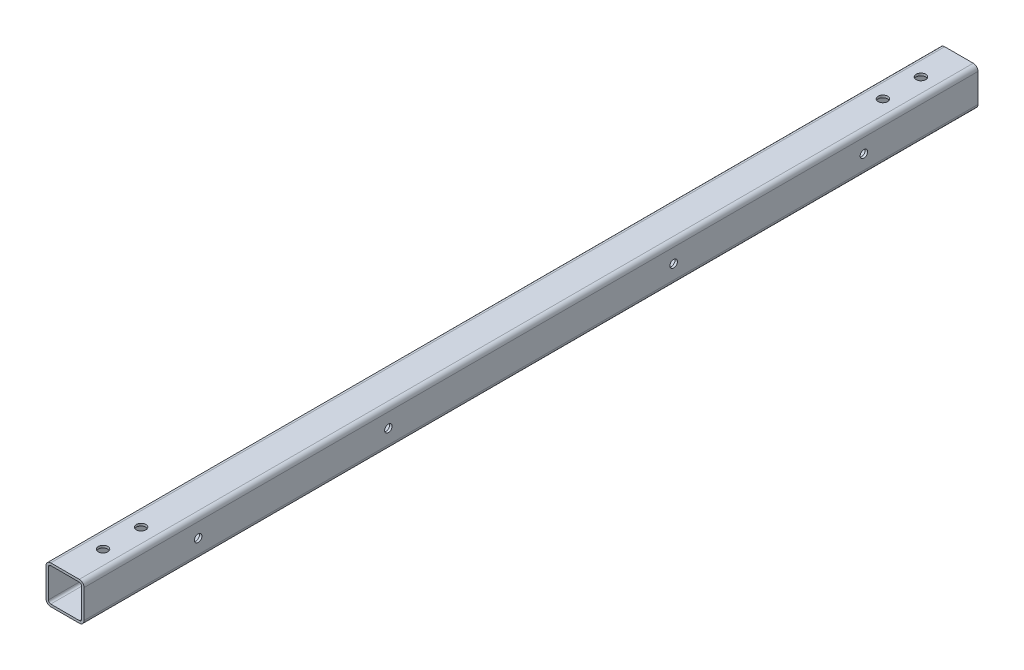
ISO-10303-21;
HEADER;
FILE_DESCRIPTION(('STEP AP214'),'2;1');
FILE_NAME('part.step','',(''),(''),'','','');
FILE_SCHEMA(('AUTOMOTIVE_DESIGN { 1 0 10303 214 1 1 1 1 }'));
ENDSEC;
DATA;
#1=APPLICATION_CONTEXT('core data for automotive mechanical design processes');
#2=APPLICATION_PROTOCOL_DEFINITION('international standard','automotive_design',2000,#1);
#3=PRODUCT_CONTEXT('',#1,'mechanical');
#4=PRODUCT('Part','Part','',(#3));
#5=PRODUCT_RELATED_PRODUCT_CATEGORY('part','',(#4));
#6=PRODUCT_DEFINITION_FORMATION('','',#4);
#7=PRODUCT_DEFINITION_CONTEXT('part definition',#1,'design');
#8=PRODUCT_DEFINITION('design','',#6,#7);
#9=PRODUCT_DEFINITION_SHAPE('','',#8);
#10=(LENGTH_UNIT() NAMED_UNIT(*) SI_UNIT(.MILLI.,.METRE.));
#11=(NAMED_UNIT(*) PLANE_ANGLE_UNIT() SI_UNIT($,.RADIAN.));
#12=(NAMED_UNIT(*) SI_UNIT($,.STERADIAN.) SOLID_ANGLE_UNIT());
#13=UNCERTAINTY_MEASURE_WITH_UNIT(LENGTH_MEASURE(1.E-05),#10,'distance_accuracy_value','');
#14=(GEOMETRIC_REPRESENTATION_CONTEXT(3) GLOBAL_UNCERTAINTY_ASSIGNED_CONTEXT((#13)) GLOBAL_UNIT_ASSIGNED_CONTEXT((#10,
#11,#12)) REPRESENTATION_CONTEXT('',''));
#15=CARTESIAN_POINT('',(0.,0.,0.));
#16=DIRECTION('',(0.,0.,1.));
#17=DIRECTION('',(1.,0.,0.));
#18=AXIS2_PLACEMENT_3D('',#15,#16,#17);
#19=CARTESIAN_POINT('',(-12.7,-12.7,-298.45));
#20=DIRECTION('',(0.,0.,-1.));
#21=DIRECTION('',(-1.,0.,0.));
#22=AXIS2_PLACEMENT_3D('',#19,#20,#21);
#23=PLANE('',#22);
#24=DIRECTION('',(0.,-1.,0.));
#25=VECTOR('',#24,1.);
#26=CARTESIAN_POINT('',(-12.7,12.7,-298.45));
#27=LINE('',#26,#25);
#28=CARTESIAN_POINT('',(-12.7,9.525,-298.45));
#29=VERTEX_POINT('',#28);
#30=CARTESIAN_POINT('',(-12.7,-9.525,-298.45));
#31=VERTEX_POINT('',#30);
#32=EDGE_CURVE('E234',#29,#31,#27,.T.);
#33=ORIENTED_EDGE('',*,*,#32,.F.);
#34=CARTESIAN_POINT('',(-9.525,9.525,-298.45));
#35=DIRECTION('',(0.,0.,-1.));
#36=DIRECTION('',(-1.,0.,0.));
#37=AXIS2_PLACEMENT_3D('',#34,#35,#36);
#38=CIRCLE('',#37,3.175);
#39=CARTESIAN_POINT('',(-9.525,12.7,-298.45));
#40=VERTEX_POINT('',#39);
#41=EDGE_CURVE('E260',#29,#40,#38,.T.);
#42=ORIENTED_EDGE('',*,*,#41,.T.);
#43=DIRECTION('',(1.,0.,0.));
#44=VECTOR('',#43,1.);
#45=CARTESIAN_POINT('',(-12.7,12.7,-298.45));
#46=LINE('',#45,#44);
#47=CARTESIAN_POINT('',(9.525,12.7,-298.45));
#48=VERTEX_POINT('',#47);
#49=EDGE_CURVE('E221',#40,#48,#46,.T.);
#50=ORIENTED_EDGE('',*,*,#49,.T.);
#51=CARTESIAN_POINT('',(9.525,9.525,-298.45));
#52=DIRECTION('',(0.,0.,-1.));
#53=DIRECTION('',(-1.,0.,0.));
#54=AXIS2_PLACEMENT_3D('',#51,#52,#53);
#55=CIRCLE('',#54,3.175);
#56=CARTESIAN_POINT('',(12.7,9.525,-298.45));
#57=VERTEX_POINT('',#56);
#58=EDGE_CURVE('E256',#48,#57,#55,.T.);
#59=ORIENTED_EDGE('',*,*,#58,.T.);
#60=DIRECTION('',(0.,1.,0.));
#61=VECTOR('',#60,1.);
#62=CARTESIAN_POINT('',(12.7,-12.7,-298.45));
#63=LINE('',#62,#61);
#64=CARTESIAN_POINT('',(12.7,-9.525,-298.45));
#65=VERTEX_POINT('',#64);
#66=EDGE_CURVE('E242',#65,#57,#63,.T.);
#67=ORIENTED_EDGE('',*,*,#66,.F.);
#68=CARTESIAN_POINT('',(9.525,-9.525,-298.45));
#69=DIRECTION('',(0.,0.,-1.));
#70=DIRECTION('',(-1.,0.,0.));
#71=AXIS2_PLACEMENT_3D('',#68,#69,#70);
#72=CIRCLE('',#71,3.175);
#73=CARTESIAN_POINT('',(9.525,-12.7,-298.45));
#74=VERTEX_POINT('',#73);
#75=EDGE_CURVE('E254',#65,#74,#72,.T.);
#76=ORIENTED_EDGE('',*,*,#75,.T.);
#77=DIRECTION('',(-1.,0.,0.));
#78=VECTOR('',#77,1.);
#79=CARTESIAN_POINT('',(12.7,-12.7,-298.45));
#80=LINE('',#79,#78);
#81=CARTESIAN_POINT('',(-9.52499999999999,-12.7,-298.45));
#82=VERTEX_POINT('',#81);
#83=EDGE_CURVE('E238',#74,#82,#80,.T.);
#84=ORIENTED_EDGE('',*,*,#83,.T.);
#85=CARTESIAN_POINT('',(-9.52499999999999,-9.525,-298.45));
#86=DIRECTION('',(0.,0.,-1.));
#87=DIRECTION('',(-1.,0.,0.));
#88=AXIS2_PLACEMENT_3D('',#85,#86,#87);
#89=CIRCLE('',#88,3.175);
#90=EDGE_CURVE('E258',#82,#31,#89,.T.);
#91=ORIENTED_EDGE('',*,*,#90,.T.);
#92=EDGE_LOOP('',(#33,#42,#50,#59,#67,#76,#84,#91));
#93=FACE_BOUND('',#92,.T.);
#94=CARTESIAN_POINT('',(-9.525,9.525,-298.45));
#95=DIRECTION('',(0.,0.,-1.));
#96=DIRECTION('',(-1.,0.,0.));
#97=AXIS2_PLACEMENT_3D('',#94,#95,#96);
#98=CIRCLE('',#97,1.5875);
#99=CARTESIAN_POINT('',(-11.1125,9.525,-298.45));
#100=VERTEX_POINT('',#99);
#101=CARTESIAN_POINT('',(-9.525,11.1125,-298.45));
#102=VERTEX_POINT('',#101);
#103=EDGE_CURVE('E202',#100,#102,#98,.T.);
#104=ORIENTED_EDGE('',*,*,#103,.F.);
#105=DIRECTION('',(0.,-1.,0.));
#106=VECTOR('',#105,1.);
#107=CARTESIAN_POINT('',(-11.1125,-12.7,-298.45));
#108=LINE('',#107,#106);
#109=CARTESIAN_POINT('',(-11.1125,-9.525,-298.45));
#110=VERTEX_POINT('',#109);
#111=EDGE_CURVE('E199',#100,#110,#108,.T.);
#112=ORIENTED_EDGE('',*,*,#111,.T.);
#113=CARTESIAN_POINT('',(-9.52499999999999,-9.525,-298.45));
#114=DIRECTION('',(0.,0.,-1.));
#115=DIRECTION('',(-1.,0.,0.));
#116=AXIS2_PLACEMENT_3D('',#113,#114,#115);
#117=CIRCLE('',#116,1.5875);
#118=CARTESIAN_POINT('',(-9.52499999999999,-11.1125,-298.45));
#119=VERTEX_POINT('',#118);
#120=EDGE_CURVE('E160',#119,#110,#117,.T.);
#121=ORIENTED_EDGE('',*,*,#120,.F.);
#122=DIRECTION('',(-1.,0.,0.));
#123=VECTOR('',#122,1.);
#124=CARTESIAN_POINT('',(-12.7,-11.1125,-298.45));
#125=LINE('',#124,#123);
#126=CARTESIAN_POINT('',(9.525,-11.1125,-298.45));
#127=VERTEX_POINT('',#126);
#128=EDGE_CURVE('E62',#127,#119,#125,.T.);
#129=ORIENTED_EDGE('',*,*,#128,.F.);
#130=CARTESIAN_POINT('',(9.525,-9.525,-298.45));
#131=DIRECTION('',(0.,0.,-1.));
#132=DIRECTION('',(-1.,0.,0.));
#133=AXIS2_PLACEMENT_3D('',#130,#131,#132);
#134=CIRCLE('',#133,1.5875);
#135=CARTESIAN_POINT('',(11.1125,-9.525,-298.45));
#136=VERTEX_POINT('',#135);
#137=EDGE_CURVE('E210',#136,#127,#134,.T.);
#138=ORIENTED_EDGE('',*,*,#137,.F.);
#139=DIRECTION('',(0.,1.,0.));
#140=VECTOR('',#139,1.);
#141=CARTESIAN_POINT('',(11.1125,-12.7,-298.45));
#142=LINE('',#141,#140);
#143=CARTESIAN_POINT('',(11.1125,9.525,-298.45));
#144=VERTEX_POINT('',#143);
#145=EDGE_CURVE('E207',#136,#144,#142,.T.);
#146=ORIENTED_EDGE('',*,*,#145,.T.);
#147=CARTESIAN_POINT('',(9.525,9.525,-298.45));
#148=DIRECTION('',(0.,0.,-1.));
#149=DIRECTION('',(-1.,0.,0.));
#150=AXIS2_PLACEMENT_3D('',#147,#148,#149);
#151=CIRCLE('',#150,1.5875);
#152=CARTESIAN_POINT('',(9.525,11.1125,-298.45));
#153=VERTEX_POINT('',#152);
#154=EDGE_CURVE('E208',#153,#144,#151,.T.);
#155=ORIENTED_EDGE('',*,*,#154,.F.);
#156=DIRECTION('',(1.,0.,0.));
#157=VECTOR('',#156,1.);
#158=CARTESIAN_POINT('',(-12.7,11.1125,-298.45));
#159=LINE('',#158,#157);
#160=EDGE_CURVE('E175',#102,#153,#159,.T.);
#161=ORIENTED_EDGE('',*,*,#160,.F.);
#162=EDGE_LOOP('',(#104,#112,#121,#129,#138,#146,#155,#161));
#163=FACE_BOUND('',#162,.T.);
#164=ADVANCED_FACE('F36',(#93,#163),#23,.T.);
#165=CARTESIAN_POINT('',(-12.7,12.7,298.45));
#166=DIRECTION('',(1.,0.,0.));
#167=DIRECTION('',(0.,1.,0.));
#168=AXIS2_PLACEMENT_3D('',#165,#166,#167);
#169=PLANE('',#168);
#170=DIRECTION('',(0.,-1.,0.));
#171=VECTOR('',#170,1.);
#172=CARTESIAN_POINT('',(-12.7,12.7,298.45));
#173=LINE('',#172,#171);
#174=CARTESIAN_POINT('',(-12.7,9.525,298.45));
#175=VERTEX_POINT('',#174);
#176=CARTESIAN_POINT('',(-12.7,-9.525,298.45));
#177=VERTEX_POINT('',#176);
#178=EDGE_CURVE('E217',#175,#177,#173,.T.);
#179=ORIENTED_EDGE('',*,*,#178,.F.);
#180=DIRECTION('',(0.,0.,-1.));
#181=VECTOR('',#180,1.);
#182=CARTESIAN_POINT('',(-12.7,9.525,-298.45));
#183=LINE('',#182,#181);
#184=EDGE_CURVE('E250',#175,#29,#183,.T.);
#185=ORIENTED_EDGE('',*,*,#184,.T.);
#186=ORIENTED_EDGE('',*,*,#32,.T.);
#187=DIRECTION('',(0.,0.,-1.));
#188=VECTOR('',#187,1.);
#189=CARTESIAN_POINT('',(-12.7,-9.525,298.45));
#190=LINE('',#189,#188);
#191=EDGE_CURVE('E233',#31,#177,#190,.F.);
#192=ORIENTED_EDGE('',*,*,#191,.T.);
#193=EDGE_LOOP('',(#179,#185,#186,#192));
#194=FACE_BOUND('',#193,.T.);
#195=ADVANCED_FACE('F378',(#194),#169,.F.);
#196=CARTESIAN_POINT('',(12.7,-12.7,298.45));
#197=DIRECTION('',(0.,-1.,0.));
#198=DIRECTION('',(1.,0.,0.));
#199=AXIS2_PLACEMENT_3D('',#196,#197,#198);
#200=PLANE('',#199);
#201=CARTESIAN_POINT('',(0.,-12.7,-273.05));
#202=DIRECTION('',(0.,-1.,0.));
#203=DIRECTION('',(1.,0.,0.));
#204=AXIS2_PLACEMENT_3D('',#201,#202,#203);
#205=CIRCLE('',#204,3.175);
#206=CARTESIAN_POINT('',(3.17500000000005,-12.7,-273.05));
#207=VERTEX_POINT('',#206);
#208=EDGE_CURVE('E698',#207,#207,#205,.T.);
#209=ORIENTED_EDGE('',*,*,#208,.F.);
#210=EDGE_LOOP('',(#209));
#211=FACE_BOUND('',#210,.T.);
#212=CARTESIAN_POINT('',(0.,-12.7,-247.65));
#213=DIRECTION('',(0.,-1.,0.));
#214=DIRECTION('',(1.,0.,0.));
#215=AXIS2_PLACEMENT_3D('',#212,#213,#214);
#216=CIRCLE('',#215,3.175);
#217=CARTESIAN_POINT('',(3.17500000000004,-12.7,-247.65));
#218=VERTEX_POINT('',#217);
#219=EDGE_CURVE('E305',#218,#218,#216,.T.);
#220=ORIENTED_EDGE('',*,*,#219,.F.);
#221=EDGE_LOOP('',(#220));
#222=FACE_BOUND('',#221,.T.);
#223=CARTESIAN_POINT('',(0.,-12.7,247.65));
#224=DIRECTION('',(0.,-1.,0.));
#225=DIRECTION('',(1.,0.,0.));
#226=AXIS2_PLACEMENT_3D('',#223,#224,#225);
#227=CIRCLE('',#226,3.175);
#228=CARTESIAN_POINT('',(3.17499999999998,-12.7,247.65));
#229=VERTEX_POINT('',#228);
#230=EDGE_CURVE('E302',#229,#229,#227,.T.);
#231=ORIENTED_EDGE('',*,*,#230,.F.);
#232=EDGE_LOOP('',(#231));
#233=FACE_BOUND('',#232,.T.);
#234=CARTESIAN_POINT('',(0.,-12.7,273.05));
#235=DIRECTION('',(0.,-1.,0.));
#236=DIRECTION('',(1.,0.,0.));
#237=AXIS2_PLACEMENT_3D('',#234,#235,#236);
#238=CIRCLE('',#237,3.17499999999999);
#239=CARTESIAN_POINT('',(3.17499999999997,-12.7,273.05));
#240=VERTEX_POINT('',#239);
#241=EDGE_CURVE('E321',#240,#240,#238,.T.);
#242=ORIENTED_EDGE('',*,*,#241,.F.);
#243=EDGE_LOOP('',(#242));
#244=FACE_BOUND('',#243,.T.);
#245=DIRECTION('',(-1.,0.,0.));
#246=VECTOR('',#245,1.);
#247=CARTESIAN_POINT('',(12.7,-12.7,298.45));
#248=LINE('',#247,#246);
#249=CARTESIAN_POINT('',(9.525,-12.7,298.45));
#250=VERTEX_POINT('',#249);
#251=CARTESIAN_POINT('',(-9.52499999999999,-12.7,298.45));
#252=VERTEX_POINT('',#251);
#253=EDGE_CURVE('E220',#250,#252,#248,.T.);
#254=ORIENTED_EDGE('',*,*,#253,.T.);
#255=DIRECTION('',(0.,0.,-1.));
#256=VECTOR('',#255,1.);
#257=CARTESIAN_POINT('',(-9.52499999999999,-12.7,-298.45));
#258=LINE('',#257,#256);
#259=EDGE_CURVE('E280',#252,#82,#258,.T.);
#260=ORIENTED_EDGE('',*,*,#259,.T.);
#261=ORIENTED_EDGE('',*,*,#83,.F.);
#262=DIRECTION('',(0.,0.,-1.));
#263=VECTOR('',#262,1.);
#264=CARTESIAN_POINT('',(9.525,-12.7,298.45));
#265=LINE('',#264,#263);
#266=EDGE_CURVE('E277',#74,#250,#265,.F.);
#267=ORIENTED_EDGE('',*,*,#266,.T.);
#268=EDGE_LOOP('',(#254,#260,#261,#267));
#269=FACE_BOUND('',#268,.T.);
#270=ADVANCED_FACE('F383',(#211,#222,#233,#244,#269),#200,.T.);
#271=CARTESIAN_POINT('',(12.7,-12.7,298.45));
#272=DIRECTION('',(-1.,0.,0.));
#273=DIRECTION('',(0.,0.,1.));
#274=AXIS2_PLACEMENT_3D('',#271,#272,#273);
#275=PLANE('',#274);
#276=CARTESIAN_POINT('',(12.7,0.,95.2500000000002));
#277=DIRECTION('',(-1.,0.,0.));
#278=DIRECTION('',(0.,0.,1.));
#279=AXIS2_PLACEMENT_3D('',#276,#277,#278);
#280=CIRCLE('',#279,2.49999999999999);
#281=CARTESIAN_POINT('',(12.7,0.,97.7500000000002));
#282=VERTEX_POINT('',#281);
#283=EDGE_CURVE('E676',#282,#282,#280,.F.);
#284=ORIENTED_EDGE('',*,*,#283,.F.);
#285=EDGE_LOOP('',(#284));
#286=FACE_BOUND('',#285,.T.);
#287=CARTESIAN_POINT('',(12.7,0.,222.25));
#288=DIRECTION('',(-1.,0.,0.));
#289=DIRECTION('',(0.,0.,1.));
#290=AXIS2_PLACEMENT_3D('',#287,#288,#289);
#291=CIRCLE('',#290,2.49999999999999);
#292=CARTESIAN_POINT('',(12.7,0.,224.75));
#293=VERTEX_POINT('',#292);
#294=EDGE_CURVE('E680',#293,#293,#291,.F.);
#295=ORIENTED_EDGE('',*,*,#294,.F.);
#296=EDGE_LOOP('',(#295));
#297=FACE_BOUND('',#296,.T.);
#298=CARTESIAN_POINT('',(12.7,0.,-222.25));
#299=DIRECTION('',(-1.,0.,0.));
#300=DIRECTION('',(0.,0.,1.));
#301=AXIS2_PLACEMENT_3D('',#298,#299,#300);
#302=CIRCLE('',#301,2.49999999999999);
#303=CARTESIAN_POINT('',(12.7,0.,-219.75));
#304=VERTEX_POINT('',#303);
#305=EDGE_CURVE('E689',#304,#304,#302,.F.);
#306=ORIENTED_EDGE('',*,*,#305,.F.);
#307=EDGE_LOOP('',(#306));
#308=FACE_BOUND('',#307,.T.);
#309=CARTESIAN_POINT('',(12.7,0.,-95.2499999999998));
#310=DIRECTION('',(-1.,0.,0.));
#311=DIRECTION('',(0.,0.,1.));
#312=AXIS2_PLACEMENT_3D('',#309,#310,#311);
#313=CIRCLE('',#312,2.49999999999999);
#314=CARTESIAN_POINT('',(12.7,0.,-92.7499999999998));
#315=VERTEX_POINT('',#314);
#316=EDGE_CURVE('E695',#315,#315,#313,.F.);
#317=ORIENTED_EDGE('',*,*,#316,.F.);
#318=EDGE_LOOP('',(#317));
#319=FACE_BOUND('',#318,.T.);
#320=ORIENTED_EDGE('',*,*,#66,.T.);
#321=DIRECTION('',(0.,0.,-1.));
#322=VECTOR('',#321,1.);
#323=CARTESIAN_POINT('',(12.7,9.525,298.45));
#324=LINE('',#323,#322);
#325=CARTESIAN_POINT('',(12.7,9.525,298.45));
#326=VERTEX_POINT('',#325);
#327=EDGE_CURVE('E11',#57,#326,#324,.F.);
#328=ORIENTED_EDGE('',*,*,#327,.T.);
#329=DIRECTION('',(0.,1.,0.));
#330=VECTOR('',#329,1.);
#331=CARTESIAN_POINT('',(12.7,-12.7,298.45));
#332=LINE('',#331,#330);
#333=CARTESIAN_POINT('',(12.7,-9.525,298.45));
#334=VERTEX_POINT('',#333);
#335=EDGE_CURVE('E225',#334,#326,#332,.T.);
#336=ORIENTED_EDGE('',*,*,#335,.F.);
#337=DIRECTION('',(0.,0.,-1.));
#338=VECTOR('',#337,1.);
#339=CARTESIAN_POINT('',(12.7,-9.525,-298.45));
#340=LINE('',#339,#338);
#341=EDGE_CURVE('E46',#334,#65,#340,.T.);
#342=ORIENTED_EDGE('',*,*,#341,.T.);
#343=EDGE_LOOP('',(#320,#328,#336,#342));
#344=FACE_BOUND('',#343,.T.);
#345=ADVANCED_FACE('F393',(#286,#297,#308,#319,#344),#275,.F.);
#346=CARTESIAN_POINT('',(-12.7,12.7,298.45));
#347=DIRECTION('',(0.,1.,0.));
#348=DIRECTION('',(-1.,0.,0.));
#349=AXIS2_PLACEMENT_3D('',#346,#347,#348);
#350=PLANE('',#349);
#351=CARTESIAN_POINT('',(0.,12.7,-273.05));
#352=DIRECTION('',(0.,-1.,0.));
#353=DIRECTION('',(1.,0.,0.));
#354=AXIS2_PLACEMENT_3D('',#351,#352,#353);
#355=CIRCLE('',#354,3.175);
#356=CARTESIAN_POINT('',(3.17500000000005,12.7,-273.05));
#357=VERTEX_POINT('',#356);
#358=EDGE_CURVE('E699',#357,#357,#355,.T.);
#359=ORIENTED_EDGE('',*,*,#358,.T.);
#360=EDGE_LOOP('',(#359));
#361=FACE_BOUND('',#360,.T.);
#362=CARTESIAN_POINT('',(0.,12.7,-247.65));
#363=DIRECTION('',(0.,-1.,0.));
#364=DIRECTION('',(1.,0.,0.));
#365=AXIS2_PLACEMENT_3D('',#362,#363,#364);
#366=CIRCLE('',#365,3.175);
#367=CARTESIAN_POINT('',(3.17500000000005,12.7,-247.65));
#368=VERTEX_POINT('',#367);
#369=EDGE_CURVE('E298',#368,#368,#366,.T.);
#370=ORIENTED_EDGE('',*,*,#369,.T.);
#371=EDGE_LOOP('',(#370));
#372=FACE_BOUND('',#371,.T.);
#373=CARTESIAN_POINT('',(0.,12.7,247.65));
#374=DIRECTION('',(0.,-1.,0.));
#375=DIRECTION('',(1.,0.,0.));
#376=AXIS2_PLACEMENT_3D('',#373,#374,#375);
#377=CIRCLE('',#376,3.175);
#378=CARTESIAN_POINT('',(3.17499999999999,12.7,247.65));
#379=VERTEX_POINT('',#378);
#380=EDGE_CURVE('E294',#379,#379,#377,.T.);
#381=ORIENTED_EDGE('',*,*,#380,.T.);
#382=EDGE_LOOP('',(#381));
#383=FACE_BOUND('',#382,.T.);
#384=CARTESIAN_POINT('',(0.,12.7,273.05));
#385=DIRECTION('',(0.,-1.,0.));
#386=DIRECTION('',(1.,0.,0.));
#387=AXIS2_PLACEMENT_3D('',#384,#385,#386);
#388=CIRCLE('',#387,3.17499999999999);
#389=CARTESIAN_POINT('',(3.17499999999997,12.7,273.05));
#390=VERTEX_POINT('',#389);
#391=EDGE_CURVE('E290',#390,#390,#388,.T.);
#392=ORIENTED_EDGE('',*,*,#391,.T.);
#393=EDGE_LOOP('',(#392));
#394=FACE_BOUND('',#393,.T.);
#395=ORIENTED_EDGE('',*,*,#49,.F.);
#396=DIRECTION('',(0.,0.,-1.));
#397=VECTOR('',#396,1.);
#398=CARTESIAN_POINT('',(-9.525,12.7,298.45));
#399=LINE('',#398,#397);
#400=CARTESIAN_POINT('',(-9.525,12.7,298.45));
#401=VERTEX_POINT('',#400);
#402=EDGE_CURVE('E266',#40,#401,#399,.F.);
#403=ORIENTED_EDGE('',*,*,#402,.T.);
#404=DIRECTION('',(1.,0.,0.));
#405=VECTOR('',#404,1.);
#406=CARTESIAN_POINT('',(-12.7,12.7,298.45));
#407=LINE('',#406,#405);
#408=CARTESIAN_POINT('',(9.525,12.7,298.45));
#409=VERTEX_POINT('',#408);
#410=EDGE_CURVE('E229',#401,#409,#407,.T.);
#411=ORIENTED_EDGE('',*,*,#410,.T.);
#412=DIRECTION('',(0.,0.,-1.));
#413=VECTOR('',#412,1.);
#414=CARTESIAN_POINT('',(9.525,12.7,-298.45));
#415=LINE('',#414,#413);
#416=EDGE_CURVE('E262',#409,#48,#415,.T.);
#417=ORIENTED_EDGE('',*,*,#416,.T.);
#418=EDGE_LOOP('',(#395,#403,#411,#417));
#419=FACE_BOUND('',#418,.T.);
#420=ADVANCED_FACE('F390',(#361,#372,#383,#394,#419),#350,.T.);
#421=CARTESIAN_POINT('',(-12.7,-12.7,298.45));
#422=DIRECTION('',(0.,0.,-1.));
#423=DIRECTION('',(-1.,0.,0.));
#424=AXIS2_PLACEMENT_3D('',#421,#422,#423);
#425=PLANE('',#424);
#426=CARTESIAN_POINT('',(-9.525,9.525,298.45));
#427=DIRECTION('',(0.,0.,-1.));
#428=DIRECTION('',(-1.,0.,0.));
#429=AXIS2_PLACEMENT_3D('',#426,#427,#428);
#430=CIRCLE('',#429,1.5875);
#431=CARTESIAN_POINT('',(-9.525,11.1125,298.45));
#432=VERTEX_POINT('',#431);
#433=CARTESIAN_POINT('',(-11.1125,9.525,298.45));
#434=VERTEX_POINT('',#433);
#435=EDGE_CURVE('E182',#432,#434,#430,.F.);
#436=ORIENTED_EDGE('',*,*,#435,.F.);
#437=DIRECTION('',(1.,0.,0.));
#438=VECTOR('',#437,1.);
#439=CARTESIAN_POINT('',(-12.7,11.1125,298.45));
#440=LINE('',#439,#438);
#441=CARTESIAN_POINT('',(9.525,11.1125,298.45));
#442=VERTEX_POINT('',#441);
#443=EDGE_CURVE('E166',#432,#442,#440,.T.);
#444=ORIENTED_EDGE('',*,*,#443,.T.);
#445=CARTESIAN_POINT('',(9.525,9.525,298.45));
#446=DIRECTION('',(0.,0.,-1.));
#447=DIRECTION('',(-1.,0.,0.));
#448=AXIS2_PLACEMENT_3D('',#445,#446,#447);
#449=CIRCLE('',#448,1.5875);
#450=CARTESIAN_POINT('',(11.1125,9.525,298.45));
#451=VERTEX_POINT('',#450);
#452=EDGE_CURVE('E183',#451,#442,#449,.F.);
#453=ORIENTED_EDGE('',*,*,#452,.F.);
#454=DIRECTION('',(0.,1.,0.));
#455=VECTOR('',#454,1.);
#456=CARTESIAN_POINT('',(11.1125,-12.7,298.45));
#457=LINE('',#456,#455);
#458=CARTESIAN_POINT('',(11.1125,-9.525,298.45));
#459=VERTEX_POINT('',#458);
#460=EDGE_CURVE('E54',#459,#451,#457,.T.);
#461=ORIENTED_EDGE('',*,*,#460,.F.);
#462=CARTESIAN_POINT('',(9.525,-9.525,298.45));
#463=DIRECTION('',(0.,0.,-1.));
#464=DIRECTION('',(-1.,0.,0.));
#465=AXIS2_PLACEMENT_3D('',#462,#463,#464);
#466=CIRCLE('',#465,1.5875);
#467=CARTESIAN_POINT('',(9.525,-11.1125,298.45));
#468=VERTEX_POINT('',#467);
#469=EDGE_CURVE('E187',#468,#459,#466,.F.);
#470=ORIENTED_EDGE('',*,*,#469,.F.);
#471=DIRECTION('',(-1.,0.,0.));
#472=VECTOR('',#471,1.);
#473=CARTESIAN_POINT('',(-12.7,-11.1125,298.45));
#474=LINE('',#473,#472);
#475=CARTESIAN_POINT('',(-9.52499999999999,-11.1125,298.45));
#476=VERTEX_POINT('',#475);
#477=EDGE_CURVE('E174',#468,#476,#474,.T.);
#478=ORIENTED_EDGE('',*,*,#477,.T.);
#479=CARTESIAN_POINT('',(-9.52499999999999,-9.525,298.45));
#480=DIRECTION('',(0.,0.,-1.));
#481=DIRECTION('',(-1.,0.,0.));
#482=AXIS2_PLACEMENT_3D('',#479,#480,#481);
#483=CIRCLE('',#482,1.5875);
#484=CARTESIAN_POINT('',(-11.1125,-9.525,298.45));
#485=VERTEX_POINT('',#484);
#486=EDGE_CURVE('E158',#485,#476,#483,.F.);
#487=ORIENTED_EDGE('',*,*,#486,.F.);
#488=DIRECTION('',(0.,-1.,0.));
#489=VECTOR('',#488,1.);
#490=CARTESIAN_POINT('',(-11.1125,-12.7,298.45));
#491=LINE('',#490,#489);
#492=EDGE_CURVE('E170',#434,#485,#491,.T.);
#493=ORIENTED_EDGE('',*,*,#492,.F.);
#494=EDGE_LOOP('',(#436,#444,#453,#461,#470,#478,#487,#493));
#495=FACE_BOUND('',#494,.T.);
#496=ORIENTED_EDGE('',*,*,#410,.F.);
#497=CARTESIAN_POINT('',(-9.525,9.525,298.45));
#498=DIRECTION('',(0.,0.,-1.));
#499=DIRECTION('',(-1.,0.,0.));
#500=AXIS2_PLACEMENT_3D('',#497,#498,#499);
#501=CIRCLE('',#500,3.175);
#502=EDGE_CURVE('E275',#401,#175,#501,.F.);
#503=ORIENTED_EDGE('',*,*,#502,.T.);
#504=ORIENTED_EDGE('',*,*,#178,.T.);
#505=CARTESIAN_POINT('',(-9.52499999999999,-9.525,298.45));
#506=DIRECTION('',(0.,0.,-1.));
#507=DIRECTION('',(-1.,0.,0.));
#508=AXIS2_PLACEMENT_3D('',#505,#506,#507);
#509=CIRCLE('',#508,3.175);
#510=EDGE_CURVE('E273',#177,#252,#509,.F.);
#511=ORIENTED_EDGE('',*,*,#510,.T.);
#512=ORIENTED_EDGE('',*,*,#253,.F.);
#513=CARTESIAN_POINT('',(9.525,-9.525,298.45));
#514=DIRECTION('',(0.,0.,-1.));
#515=DIRECTION('',(-1.,0.,0.));
#516=AXIS2_PLACEMENT_3D('',#513,#514,#515);
#517=CIRCLE('',#516,3.175);
#518=EDGE_CURVE('E269',#250,#334,#517,.F.);
#519=ORIENTED_EDGE('',*,*,#518,.T.);
#520=ORIENTED_EDGE('',*,*,#335,.T.);
#521=CARTESIAN_POINT('',(9.525,9.525,298.45));
#522=DIRECTION('',(0.,0.,-1.));
#523=DIRECTION('',(-1.,0.,0.));
#524=AXIS2_PLACEMENT_3D('',#521,#522,#523);
#525=CIRCLE('',#524,3.175);
#526=EDGE_CURVE('E271',#326,#409,#525,.F.);
#527=ORIENTED_EDGE('',*,*,#526,.T.);
#528=EDGE_LOOP('',(#496,#503,#504,#511,#512,#519,#520,#527));
#529=FACE_BOUND('',#528,.T.);
#530=ADVANCED_FACE('F178',(#495,#529),#425,.F.);
#531=CARTESIAN_POINT('',(-9.525,9.525,298.45));
#532=DIRECTION('',(0.,0.,1.));
#533=DIRECTION('',(1.,0.,0.));
#534=AXIS2_PLACEMENT_3D('',#531,#532,#533);
#535=CYLINDRICAL_SURFACE('',#534,3.175);
#536=ORIENTED_EDGE('',*,*,#502,.F.);
#537=ORIENTED_EDGE('',*,*,#402,.F.);
#538=ORIENTED_EDGE('',*,*,#41,.F.);
#539=ORIENTED_EDGE('',*,*,#184,.F.);
#540=EDGE_LOOP('',(#536,#537,#538,#539));
#541=FACE_BOUND('',#540,.T.);
#542=ADVANCED_FACE('F401',(#541),#535,.T.);
#543=CARTESIAN_POINT('',(-9.52499999999999,-9.525,298.45));
#544=DIRECTION('',(0.,0.,1.));
#545=DIRECTION('',(1.,0.,0.));
#546=AXIS2_PLACEMENT_3D('',#543,#544,#545);
#547=CYLINDRICAL_SURFACE('',#546,3.175);
#548=ORIENTED_EDGE('',*,*,#510,.F.);
#549=ORIENTED_EDGE('',*,*,#191,.F.);
#550=ORIENTED_EDGE('',*,*,#90,.F.);
#551=ORIENTED_EDGE('',*,*,#259,.F.);
#552=EDGE_LOOP('',(#548,#549,#550,#551));
#553=FACE_BOUND('',#552,.T.);
#554=ADVANCED_FACE('F404',(#553),#547,.T.);
#555=CARTESIAN_POINT('',(9.525,9.525,298.45));
#556=DIRECTION('',(0.,0.,1.));
#557=DIRECTION('',(1.,0.,0.));
#558=AXIS2_PLACEMENT_3D('',#555,#556,#557);
#559=CYLINDRICAL_SURFACE('',#558,3.175);
#560=ORIENTED_EDGE('',*,*,#526,.F.);
#561=ORIENTED_EDGE('',*,*,#327,.F.);
#562=ORIENTED_EDGE('',*,*,#58,.F.);
#563=ORIENTED_EDGE('',*,*,#416,.F.);
#564=EDGE_LOOP('',(#560,#561,#562,#563));
#565=FACE_BOUND('',#564,.T.);
#566=ADVANCED_FACE('F407',(#565),#559,.T.);
#567=CARTESIAN_POINT('',(9.525,-9.525,298.45));
#568=DIRECTION('',(0.,0.,1.));
#569=DIRECTION('',(1.,0.,0.));
#570=AXIS2_PLACEMENT_3D('',#567,#568,#569);
#571=CYLINDRICAL_SURFACE('',#570,3.175);
#572=ORIENTED_EDGE('',*,*,#518,.F.);
#573=ORIENTED_EDGE('',*,*,#266,.F.);
#574=ORIENTED_EDGE('',*,*,#75,.F.);
#575=ORIENTED_EDGE('',*,*,#341,.F.);
#576=EDGE_LOOP('',(#572,#573,#574,#575));
#577=FACE_BOUND('',#576,.T.);
#578=ADVANCED_FACE('F38',(#577),#571,.T.);
#579=CARTESIAN_POINT('',(-11.1125,12.7,298.45));
#580=DIRECTION('',(1.,0.,0.));
#581=DIRECTION('',(0.,1.,0.));
#582=AXIS2_PLACEMENT_3D('',#579,#580,#581);
#583=PLANE('',#582);
#584=ORIENTED_EDGE('',*,*,#492,.T.);
#585=DIRECTION('',(0.,0.,1.));
#586=VECTOR('',#585,1.);
#587=CARTESIAN_POINT('',(-11.1125,-9.525,298.45));
#588=LINE('',#587,#586);
#589=EDGE_CURVE('E154',#110,#485,#588,.T.);
#590=ORIENTED_EDGE('',*,*,#589,.F.);
#591=ORIENTED_EDGE('',*,*,#111,.F.);
#592=DIRECTION('',(0.,0.,1.));
#593=VECTOR('',#592,1.);
#594=CARTESIAN_POINT('',(-11.1125,9.525,298.45));
#595=LINE('',#594,#593);
#596=EDGE_CURVE('E165',#434,#100,#595,.F.);
#597=ORIENTED_EDGE('',*,*,#596,.F.);
#598=EDGE_LOOP('',(#584,#590,#591,#597));
#599=FACE_BOUND('',#598,.T.);
#600=ADVANCED_FACE('F171',(#599),#583,.T.);
#601=CARTESIAN_POINT('',(12.7,-11.1125,298.45));
#602=DIRECTION('',(0.,-1.,0.));
#603=DIRECTION('',(1.,0.,0.));
#604=AXIS2_PLACEMENT_3D('',#601,#602,#603);
#605=PLANE('',#604);
#606=CARTESIAN_POINT('',(0.,-11.1125,-273.05));
#607=DIRECTION('',(0.,-1.,0.));
#608=DIRECTION('',(1.,0.,0.));
#609=AXIS2_PLACEMENT_3D('',#606,#607,#608);
#610=CIRCLE('',#609,3.175);
#611=CARTESIAN_POINT('',(3.17500000000005,-11.1125,-273.05));
#612=VERTEX_POINT('',#611);
#613=EDGE_CURVE('E310',#612,#612,#610,.T.);
#614=ORIENTED_EDGE('',*,*,#613,.T.);
#615=EDGE_LOOP('',(#614));
#616=FACE_BOUND('',#615,.T.);
#617=CARTESIAN_POINT('',(0.,-11.1125,-247.65));
#618=DIRECTION('',(0.,-1.,0.));
#619=DIRECTION('',(1.,0.,0.));
#620=AXIS2_PLACEMENT_3D('',#617,#618,#619);
#621=CIRCLE('',#620,3.175);
#622=CARTESIAN_POINT('',(3.17500000000005,-11.1125,-247.65));
#623=VERTEX_POINT('',#622);
#624=EDGE_CURVE('E297',#623,#623,#621,.T.);
#625=ORIENTED_EDGE('',*,*,#624,.T.);
#626=EDGE_LOOP('',(#625));
#627=FACE_BOUND('',#626,.T.);
#628=CARTESIAN_POINT('',(0.,-11.1125,247.65));
#629=DIRECTION('',(0.,-1.,0.));
#630=DIRECTION('',(1.,0.,0.));
#631=AXIS2_PLACEMENT_3D('',#628,#629,#630);
#632=CIRCLE('',#631,3.175);
#633=CARTESIAN_POINT('',(3.17499999999998,-11.1125,247.65));
#634=VERTEX_POINT('',#633);
#635=EDGE_CURVE('E293',#634,#634,#632,.T.);
#636=ORIENTED_EDGE('',*,*,#635,.T.);
#637=EDGE_LOOP('',(#636));
#638=FACE_BOUND('',#637,.T.);
#639=CARTESIAN_POINT('',(0.,-11.1125,273.05));
#640=DIRECTION('',(0.,-1.,0.));
#641=DIRECTION('',(1.,0.,0.));
#642=AXIS2_PLACEMENT_3D('',#639,#640,#641);
#643=CIRCLE('',#642,3.17499999999999);
#644=CARTESIAN_POINT('',(3.17499999999997,-11.1125,273.05));
#645=VERTEX_POINT('',#644);
#646=EDGE_CURVE('E201',#645,#645,#643,.T.);
#647=ORIENTED_EDGE('',*,*,#646,.T.);
#648=EDGE_LOOP('',(#647));
#649=FACE_BOUND('',#648,.T.);
#650=ORIENTED_EDGE('',*,*,#477,.F.);
#651=DIRECTION('',(0.,0.,1.));
#652=VECTOR('',#651,1.);
#653=CARTESIAN_POINT('',(9.525,-11.1125,298.45));
#654=LINE('',#653,#652);
#655=EDGE_CURVE('E185',#127,#468,#654,.T.);
#656=ORIENTED_EDGE('',*,*,#655,.F.);
#657=ORIENTED_EDGE('',*,*,#128,.T.);
#658=DIRECTION('',(0.,0.,1.));
#659=VECTOR('',#658,1.);
#660=CARTESIAN_POINT('',(-9.52499999999999,-11.1125,298.45));
#661=LINE('',#660,#659);
#662=EDGE_CURVE('E339',#476,#119,#661,.F.);
#663=ORIENTED_EDGE('',*,*,#662,.F.);
#664=EDGE_LOOP('',(#650,#656,#657,#663));
#665=FACE_BOUND('',#664,.T.);
#666=ADVANCED_FACE('F364',(#616,#627,#638,#649,#665),#605,.F.);
#667=CARTESIAN_POINT('',(11.1125,-12.7,298.45));
#668=DIRECTION('',(-1.,0.,0.));
#669=DIRECTION('',(0.,0.,1.));
#670=AXIS2_PLACEMENT_3D('',#667,#668,#669);
#671=PLANE('',#670);
#672=CARTESIAN_POINT('',(11.1125,0.,95.2500000000002));
#673=DIRECTION('',(-1.,0.,0.));
#674=DIRECTION('',(0.,0.,1.));
#675=AXIS2_PLACEMENT_3D('',#672,#673,#674);
#676=CIRCLE('',#675,2.49999999999999);
#677=CARTESIAN_POINT('',(11.1125,0.,97.7500000000002));
#678=VERTEX_POINT('',#677);
#679=EDGE_CURVE('E673',#678,#678,#676,.T.);
#680=ORIENTED_EDGE('',*,*,#679,.F.);
#681=EDGE_LOOP('',(#680));
#682=FACE_BOUND('',#681,.T.);
#683=CARTESIAN_POINT('',(11.1125,0.,222.25));
#684=DIRECTION('',(-1.,0.,0.));
#685=DIRECTION('',(0.,0.,1.));
#686=AXIS2_PLACEMENT_3D('',#683,#684,#685);
#687=CIRCLE('',#686,2.49999999999999);
#688=CARTESIAN_POINT('',(11.1125,0.,224.75));
#689=VERTEX_POINT('',#688);
#690=EDGE_CURVE('E677',#689,#689,#687,.T.);
#691=ORIENTED_EDGE('',*,*,#690,.F.);
#692=EDGE_LOOP('',(#691));
#693=FACE_BOUND('',#692,.T.);
#694=CARTESIAN_POINT('',(11.1125,0.,-222.25));
#695=DIRECTION('',(-1.,0.,0.));
#696=DIRECTION('',(0.,0.,1.));
#697=AXIS2_PLACEMENT_3D('',#694,#695,#696);
#698=CIRCLE('',#697,2.49999999999999);
#699=CARTESIAN_POINT('',(11.1125,0.,-219.75));
#700=VERTEX_POINT('',#699);
#701=EDGE_CURVE('E686',#700,#700,#698,.T.);
#702=ORIENTED_EDGE('',*,*,#701,.F.);
#703=EDGE_LOOP('',(#702));
#704=FACE_BOUND('',#703,.T.);
#705=CARTESIAN_POINT('',(11.1125,0.,-95.2499999999998));
#706=DIRECTION('',(-1.,0.,0.));
#707=DIRECTION('',(0.,0.,1.));
#708=AXIS2_PLACEMENT_3D('',#705,#706,#707);
#709=CIRCLE('',#708,2.49999999999999);
#710=CARTESIAN_POINT('',(11.1125,0.,-92.7499999999998));
#711=VERTEX_POINT('',#710);
#712=EDGE_CURVE('E692',#711,#711,#709,.T.);
#713=ORIENTED_EDGE('',*,*,#712,.F.);
#714=EDGE_LOOP('',(#713));
#715=FACE_BOUND('',#714,.T.);
#716=ORIENTED_EDGE('',*,*,#145,.F.);
#717=DIRECTION('',(0.,0.,1.));
#718=VECTOR('',#717,1.);
#719=CARTESIAN_POINT('',(11.1125,-9.525,298.45));
#720=LINE('',#719,#718);
#721=EDGE_CURVE('E336',#459,#136,#720,.F.);
#722=ORIENTED_EDGE('',*,*,#721,.F.);
#723=ORIENTED_EDGE('',*,*,#460,.T.);
#724=DIRECTION('',(0.,0.,1.));
#725=VECTOR('',#724,1.);
#726=CARTESIAN_POINT('',(11.1125,9.525,298.45));
#727=LINE('',#726,#725);
#728=EDGE_CURVE('E239',#144,#451,#727,.T.);
#729=ORIENTED_EDGE('',*,*,#728,.F.);
#730=EDGE_LOOP('',(#716,#722,#723,#729));
#731=FACE_BOUND('',#730,.T.);
#732=ADVANCED_FACE('F361',(#682,#693,#704,#715,#731),#671,.T.);
#733=CARTESIAN_POINT('',(-12.7,11.1125,298.45));
#734=DIRECTION('',(0.,1.,0.));
#735=DIRECTION('',(-1.,0.,0.));
#736=AXIS2_PLACEMENT_3D('',#733,#734,#735);
#737=PLANE('',#736);
#738=CARTESIAN_POINT('',(0.,11.1125,-273.05));
#739=DIRECTION('',(0.,1.,0.));
#740=DIRECTION('',(-1.,0.,0.));
#741=AXIS2_PLACEMENT_3D('',#738,#739,#740);
#742=CIRCLE('',#741,3.175);
#743=CARTESIAN_POINT('',(-3.17499999999994,11.1125,-273.05));
#744=VERTEX_POINT('',#743);
#745=EDGE_CURVE('E40',#744,#744,#742,.T.);
#746=ORIENTED_EDGE('',*,*,#745,.T.);
#747=EDGE_LOOP('',(#746));
#748=FACE_BOUND('',#747,.T.);
#749=CARTESIAN_POINT('',(0.,11.1125,-247.65));
#750=DIRECTION('',(0.,1.,0.));
#751=DIRECTION('',(-1.,0.,0.));
#752=AXIS2_PLACEMENT_3D('',#749,#750,#751);
#753=CIRCLE('',#752,3.175);
#754=CARTESIAN_POINT('',(-3.17499999999995,11.1125,-247.65));
#755=VERTEX_POINT('',#754);
#756=EDGE_CURVE('E295',#755,#755,#753,.T.);
#757=ORIENTED_EDGE('',*,*,#756,.T.);
#758=EDGE_LOOP('',(#757));
#759=FACE_BOUND('',#758,.T.);
#760=CARTESIAN_POINT('',(0.,11.1125,247.65));
#761=DIRECTION('',(0.,1.,0.));
#762=DIRECTION('',(-1.,0.,0.));
#763=AXIS2_PLACEMENT_3D('',#760,#761,#762);
#764=CIRCLE('',#763,3.175);
#765=CARTESIAN_POINT('',(-3.17500000000001,11.1125,247.65));
#766=VERTEX_POINT('',#765);
#767=EDGE_CURVE('E291',#766,#766,#764,.T.);
#768=ORIENTED_EDGE('',*,*,#767,.T.);
#769=EDGE_LOOP('',(#768));
#770=FACE_BOUND('',#769,.T.);
#771=CARTESIAN_POINT('',(0.,11.1125,273.05));
#772=DIRECTION('',(0.,1.,0.));
#773=DIRECTION('',(-1.,0.,0.));
#774=AXIS2_PLACEMENT_3D('',#771,#772,#773);
#775=CIRCLE('',#774,3.17499999999999);
#776=CARTESIAN_POINT('',(-3.175,11.1125,273.05));
#777=VERTEX_POINT('',#776);
#778=EDGE_CURVE('E287',#777,#777,#775,.T.);
#779=ORIENTED_EDGE('',*,*,#778,.T.);
#780=EDGE_LOOP('',(#779));
#781=FACE_BOUND('',#780,.T.);
#782=ORIENTED_EDGE('',*,*,#160,.T.);
#783=DIRECTION('',(0.,0.,1.));
#784=VECTOR('',#783,1.);
#785=CARTESIAN_POINT('',(9.525,11.1125,298.45));
#786=LINE('',#785,#784);
#787=EDGE_CURVE('E204',#442,#153,#786,.F.);
#788=ORIENTED_EDGE('',*,*,#787,.F.);
#789=ORIENTED_EDGE('',*,*,#443,.F.);
#790=DIRECTION('',(0.,0.,1.));
#791=VECTOR('',#790,1.);
#792=CARTESIAN_POINT('',(-9.525,11.1125,298.45));
#793=LINE('',#792,#791);
#794=EDGE_CURVE('E193',#102,#432,#793,.T.);
#795=ORIENTED_EDGE('',*,*,#794,.F.);
#796=EDGE_LOOP('',(#782,#788,#789,#795));
#797=FACE_BOUND('',#796,.T.);
#798=ADVANCED_FACE('F355',(#748,#759,#770,#781,#797),#737,.F.);
#799=CARTESIAN_POINT('',(-9.525,9.525,298.45));
#800=DIRECTION('',(0.,0.,1.));
#801=DIRECTION('',(1.,0.,0.));
#802=AXIS2_PLACEMENT_3D('',#799,#800,#801);
#803=CYLINDRICAL_SURFACE('',#802,1.5875);
#804=ORIENTED_EDGE('',*,*,#435,.T.);
#805=ORIENTED_EDGE('',*,*,#596,.T.);
#806=ORIENTED_EDGE('',*,*,#103,.T.);
#807=ORIENTED_EDGE('',*,*,#794,.T.);
#808=EDGE_LOOP('',(#804,#805,#806,#807));
#809=FACE_BOUND('',#808,.T.);
#810=ADVANCED_FACE('F352',(#809),#803,.F.);
#811=CARTESIAN_POINT('',(-9.52499999999999,-9.525,298.45));
#812=DIRECTION('',(0.,0.,1.));
#813=DIRECTION('',(1.,0.,0.));
#814=AXIS2_PLACEMENT_3D('',#811,#812,#813);
#815=CYLINDRICAL_SURFACE('',#814,1.5875);
#816=ORIENTED_EDGE('',*,*,#486,.T.);
#817=ORIENTED_EDGE('',*,*,#662,.T.);
#818=ORIENTED_EDGE('',*,*,#120,.T.);
#819=ORIENTED_EDGE('',*,*,#589,.T.);
#820=EDGE_LOOP('',(#816,#817,#818,#819));
#821=FACE_BOUND('',#820,.T.);
#822=ADVANCED_FACE('F156',(#821),#815,.F.);
#823=CARTESIAN_POINT('',(9.525,9.525,298.45));
#824=DIRECTION('',(0.,0.,1.));
#825=DIRECTION('',(1.,0.,0.));
#826=AXIS2_PLACEMENT_3D('',#823,#824,#825);
#827=CYLINDRICAL_SURFACE('',#826,1.5875);
#828=ORIENTED_EDGE('',*,*,#452,.T.);
#829=ORIENTED_EDGE('',*,*,#787,.T.);
#830=ORIENTED_EDGE('',*,*,#154,.T.);
#831=ORIENTED_EDGE('',*,*,#728,.T.);
#832=EDGE_LOOP('',(#828,#829,#830,#831));
#833=FACE_BOUND('',#832,.T.);
#834=ADVANCED_FACE('F359',(#833),#827,.F.);
#835=CARTESIAN_POINT('',(9.525,-9.525,298.45));
#836=DIRECTION('',(0.,0.,1.));
#837=DIRECTION('',(1.,0.,0.));
#838=AXIS2_PLACEMENT_3D('',#835,#836,#837);
#839=CYLINDRICAL_SURFACE('',#838,1.5875);
#840=ORIENTED_EDGE('',*,*,#469,.T.);
#841=ORIENTED_EDGE('',*,*,#721,.T.);
#842=ORIENTED_EDGE('',*,*,#137,.T.);
#843=ORIENTED_EDGE('',*,*,#655,.T.);
#844=EDGE_LOOP('',(#840,#841,#842,#843));
#845=FACE_BOUND('',#844,.T.);
#846=ADVANCED_FACE('F363',(#845),#839,.F.);
#847=CARTESIAN_POINT('',(0.,12.7,273.05));
#848=DIRECTION('',(0.,-1.,0.));
#849=DIRECTION('',(1.,0.,0.));
#850=AXIS2_PLACEMENT_3D('',#847,#848,#849);
#851=CYLINDRICAL_SURFACE('',#850,3.17499999999999);
#852=ORIENTED_EDGE('',*,*,#391,.F.);
#853=EDGE_LOOP('',(#852));
#854=FACE_BOUND('',#853,.T.);
#855=ORIENTED_EDGE('',*,*,#778,.F.);
#856=EDGE_LOOP('',(#855));
#857=FACE_BOUND('',#856,.T.);
#858=ADVANCED_FACE('F515',(#854,#857),#851,.F.);
#859=ORIENTED_EDGE('',*,*,#241,.T.);
#860=EDGE_LOOP('',(#859));
#861=FACE_BOUND('',#860,.T.);
#862=ORIENTED_EDGE('',*,*,#646,.F.);
#863=EDGE_LOOP('',(#862));
#864=FACE_BOUND('',#863,.T.);
#865=ADVANCED_FACE('F550',(#861,#864),#851,.F.);
#866=CARTESIAN_POINT('',(0.,12.7,247.65));
#867=DIRECTION('',(0.,-1.,0.));
#868=DIRECTION('',(1.,0.,0.));
#869=AXIS2_PLACEMENT_3D('',#866,#867,#868);
#870=CYLINDRICAL_SURFACE('',#869,3.175);
#871=ORIENTED_EDGE('',*,*,#380,.F.);
#872=EDGE_LOOP('',(#871));
#873=FACE_BOUND('',#872,.T.);
#874=ORIENTED_EDGE('',*,*,#767,.F.);
#875=EDGE_LOOP('',(#874));
#876=FACE_BOUND('',#875,.T.);
#877=ADVANCED_FACE('F560',(#873,#876),#870,.F.);
#878=ORIENTED_EDGE('',*,*,#230,.T.);
#879=EDGE_LOOP('',(#878));
#880=FACE_BOUND('',#879,.T.);
#881=ORIENTED_EDGE('',*,*,#635,.F.);
#882=EDGE_LOOP('',(#881));
#883=FACE_BOUND('',#882,.T.);
#884=ADVANCED_FACE('F569',(#880,#883),#870,.F.);
#885=CARTESIAN_POINT('',(0.,12.7,-247.65));
#886=DIRECTION('',(0.,-1.,0.));
#887=DIRECTION('',(1.,0.,0.));
#888=AXIS2_PLACEMENT_3D('',#885,#886,#887);
#889=CYLINDRICAL_SURFACE('',#888,3.175);
#890=ORIENTED_EDGE('',*,*,#369,.F.);
#891=EDGE_LOOP('',(#890));
#892=FACE_BOUND('',#891,.T.);
#893=ORIENTED_EDGE('',*,*,#756,.F.);
#894=EDGE_LOOP('',(#893));
#895=FACE_BOUND('',#894,.T.);
#896=ADVANCED_FACE('F579',(#892,#895),#889,.F.);
#897=ORIENTED_EDGE('',*,*,#219,.T.);
#898=EDGE_LOOP('',(#897));
#899=FACE_BOUND('',#898,.T.);
#900=ORIENTED_EDGE('',*,*,#624,.F.);
#901=EDGE_LOOP('',(#900));
#902=FACE_BOUND('',#901,.T.);
#903=ADVANCED_FACE('F588',(#899,#902),#889,.F.);
#904=CARTESIAN_POINT('',(0.,12.7,-273.05));
#905=DIRECTION('',(0.,-1.,0.));
#906=DIRECTION('',(1.,0.,0.));
#907=AXIS2_PLACEMENT_3D('',#904,#905,#906);
#908=CYLINDRICAL_SURFACE('',#907,3.175);
#909=ORIENTED_EDGE('',*,*,#358,.F.);
#910=EDGE_LOOP('',(#909));
#911=FACE_BOUND('',#910,.T.);
#912=ORIENTED_EDGE('',*,*,#745,.F.);
#913=EDGE_LOOP('',(#912));
#914=FACE_BOUND('',#913,.T.);
#915=ADVANCED_FACE('F598',(#911,#914),#908,.F.);
#916=ORIENTED_EDGE('',*,*,#208,.T.);
#917=EDGE_LOOP('',(#916));
#918=FACE_BOUND('',#917,.T.);
#919=ORIENTED_EDGE('',*,*,#613,.F.);
#920=EDGE_LOOP('',(#919));
#921=FACE_BOUND('',#920,.T.);
#922=ADVANCED_FACE('F607',(#918,#921),#908,.F.);
#923=CARTESIAN_POINT('',(12.701,0.,-95.2499999999998));
#924=DIRECTION('',(-1.,0.,0.));
#925=DIRECTION('',(0.,0.,1.));
#926=AXIS2_PLACEMENT_3D('',#923,#924,#925);
#927=CYLINDRICAL_SURFACE('',#926,2.49999999999999);
#928=ORIENTED_EDGE('',*,*,#712,.T.);
#929=EDGE_LOOP('',(#928));
#930=FACE_BOUND('',#929,.T.);
#931=ORIENTED_EDGE('',*,*,#316,.T.);
#932=EDGE_LOOP('',(#931));
#933=FACE_BOUND('',#932,.T.);
#934=ADVANCED_FACE('F617',(#930,#933),#927,.F.);
#935=CARTESIAN_POINT('',(12.701,0.,-222.25));
#936=DIRECTION('',(-1.,0.,0.));
#937=DIRECTION('',(0.,0.,1.));
#938=AXIS2_PLACEMENT_3D('',#935,#936,#937);
#939=CYLINDRICAL_SURFACE('',#938,2.49999999999999);
#940=ORIENTED_EDGE('',*,*,#701,.T.);
#941=EDGE_LOOP('',(#940));
#942=FACE_BOUND('',#941,.T.);
#943=ORIENTED_EDGE('',*,*,#305,.T.);
#944=EDGE_LOOP('',(#943));
#945=FACE_BOUND('',#944,.T.);
#946=ADVANCED_FACE('F636',(#942,#945),#939,.F.);
#947=CARTESIAN_POINT('',(12.701,0.,222.25));
#948=DIRECTION('',(-1.,0.,0.));
#949=DIRECTION('',(0.,0.,1.));
#950=AXIS2_PLACEMENT_3D('',#947,#948,#949);
#951=CYLINDRICAL_SURFACE('',#950,2.49999999999999);
#952=ORIENTED_EDGE('',*,*,#690,.T.);
#953=EDGE_LOOP('',(#952));
#954=FACE_BOUND('',#953,.T.);
#955=ORIENTED_EDGE('',*,*,#294,.T.);
#956=EDGE_LOOP('',(#955));
#957=FACE_BOUND('',#956,.T.);
#958=ADVANCED_FACE('F646',(#954,#957),#951,.F.);
#959=CARTESIAN_POINT('',(12.701,0.,95.2500000000002));
#960=DIRECTION('',(-1.,0.,0.));
#961=DIRECTION('',(0.,0.,1.));
#962=AXIS2_PLACEMENT_3D('',#959,#960,#961);
#963=CYLINDRICAL_SURFACE('',#962,2.49999999999999);
#964=ORIENTED_EDGE('',*,*,#679,.T.);
#965=EDGE_LOOP('',(#964));
#966=FACE_BOUND('',#965,.T.);
#967=ORIENTED_EDGE('',*,*,#283,.T.);
#968=EDGE_LOOP('',(#967));
#969=FACE_BOUND('',#968,.T.);
#970=ADVANCED_FACE('F656',(#966,#969),#963,.F.);
#971=CLOSED_SHELL('',(#164,#195,#270,#345,#420,#530,#542,#554,#566,#578,#600,#666,#732,#798,
#810,#822,#834,#846,#858,#865,#877,#884,#896,#903,#915,#922,#934,#946,#958,#970));
#972=MANIFOLD_SOLID_BREP('B2',#971);
#973=ADVANCED_BREP_SHAPE_REPRESENTATION('',(#18,#972),#14);
#974=SHAPE_DEFINITION_REPRESENTATION(#9,#973);
ENDSEC;
END-ISO-10303-21;
